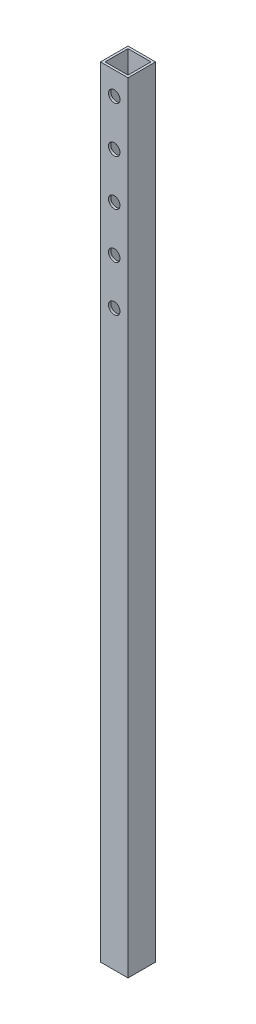
ISO-10303-21;
HEADER;
FILE_DESCRIPTION(('STEP AP214'),'2;1');
FILE_NAME('part.step','',(''),(''),'','','');
FILE_SCHEMA(('AUTOMOTIVE_DESIGN { 1 0 10303 214 1 1 1 1 }'));
ENDSEC;
DATA;
#1=APPLICATION_CONTEXT('core data for automotive mechanical design processes');
#2=APPLICATION_PROTOCOL_DEFINITION('international standard','automotive_design',2000,#1);
#3=PRODUCT_CONTEXT('',#1,'mechanical');
#4=PRODUCT('Part','Part','',(#3));
#5=PRODUCT_RELATED_PRODUCT_CATEGORY('part','',(#4));
#6=PRODUCT_DEFINITION_FORMATION('','',#4);
#7=PRODUCT_DEFINITION_CONTEXT('part definition',#1,'design');
#8=PRODUCT_DEFINITION('design','',#6,#7);
#9=PRODUCT_DEFINITION_SHAPE('','',#8);
#10=(LENGTH_UNIT() NAMED_UNIT(*) SI_UNIT(.MILLI.,.METRE.));
#11=(NAMED_UNIT(*) PLANE_ANGLE_UNIT() SI_UNIT($,.RADIAN.));
#12=(NAMED_UNIT(*) SI_UNIT($,.STERADIAN.) SOLID_ANGLE_UNIT());
#13=UNCERTAINTY_MEASURE_WITH_UNIT(LENGTH_MEASURE(1.E-05),#10,'distance_accuracy_value','');
#14=(GEOMETRIC_REPRESENTATION_CONTEXT(3) GLOBAL_UNCERTAINTY_ASSIGNED_CONTEXT((#13)) GLOBAL_UNIT_ASSIGNED_CONTEXT((#10,
#11,#12)) REPRESENTATION_CONTEXT('',''));
#15=CARTESIAN_POINT('',(0.,0.,0.));
#16=DIRECTION('',(0.,0.,1.));
#17=DIRECTION('',(1.,0.,0.));
#18=AXIS2_PLACEMENT_3D('',#15,#16,#17);
#19=CARTESIAN_POINT('',(-15.24,863.6,15.24));
#20=DIRECTION('',(0.,1.,0.));
#21=DIRECTION('',(0.,0.,1.));
#22=AXIS2_PLACEMENT_3D('',#19,#20,#21);
#23=PLANE('',#22);
#24=DIRECTION('',(0.,0.,1.));
#25=VECTOR('',#24,1.);
#26=CARTESIAN_POINT('',(-15.24,863.6,-12.7));
#27=LINE('',#26,#25);
#28=CARTESIAN_POINT('',(-15.24,863.6,-15.24));
#29=VERTEX_POINT('',#28);
#30=CARTESIAN_POINT('',(-15.24,863.6,15.24));
#31=VERTEX_POINT('',#30);
#32=EDGE_CURVE('E163',#29,#31,#27,.T.);
#33=ORIENTED_EDGE('',*,*,#32,.T.);
#34=DIRECTION('',(1.,0.,0.));
#35=VECTOR('',#34,1.);
#36=CARTESIAN_POINT('',(-12.7,863.6,15.24));
#37=LINE('',#36,#35);
#38=CARTESIAN_POINT('',(15.24,863.6,15.24));
#39=VERTEX_POINT('',#38);
#40=EDGE_CURVE('E166',#31,#39,#37,.T.);
#41=ORIENTED_EDGE('',*,*,#40,.T.);
#42=DIRECTION('',(0.,0.,-1.));
#43=VECTOR('',#42,1.);
#44=CARTESIAN_POINT('',(15.24,863.6,-12.7));
#45=LINE('',#44,#43);
#46=CARTESIAN_POINT('',(15.24,863.6,-15.24));
#47=VERTEX_POINT('',#46);
#48=EDGE_CURVE('E169',#39,#47,#45,.T.);
#49=ORIENTED_EDGE('',*,*,#48,.T.);
#50=DIRECTION('',(-1.,0.,0.));
#51=VECTOR('',#50,1.);
#52=CARTESIAN_POINT('',(-12.7,863.6,-15.24));
#53=LINE('',#52,#51);
#54=EDGE_CURVE('E171',#47,#29,#53,.T.);
#55=ORIENTED_EDGE('',*,*,#54,.T.);
#56=EDGE_LOOP('',(#33,#41,#49,#55));
#57=FACE_BOUND('',#56,.T.);
#58=DIRECTION('',(1.,0.,0.));
#59=VECTOR('',#58,1.);
#60=CARTESIAN_POINT('',(-12.7,863.6,12.7));
#61=LINE('',#60,#59);
#62=CARTESIAN_POINT('',(-12.7,863.6,12.7));
#63=VERTEX_POINT('',#62);
#64=CARTESIAN_POINT('',(12.7,863.6,12.7));
#65=VERTEX_POINT('',#64);
#66=EDGE_CURVE('E132',#63,#65,#61,.T.);
#67=ORIENTED_EDGE('',*,*,#66,.F.);
#68=DIRECTION('',(0.,0.,1.));
#69=VECTOR('',#68,1.);
#70=CARTESIAN_POINT('',(-12.7,863.6,-12.7));
#71=LINE('',#70,#69);
#72=CARTESIAN_POINT('',(-12.7,863.6,-12.7));
#73=VERTEX_POINT('',#72);
#74=EDGE_CURVE('E124',#73,#63,#71,.T.);
#75=ORIENTED_EDGE('',*,*,#74,.F.);
#76=DIRECTION('',(-1.,0.,0.));
#77=VECTOR('',#76,1.);
#78=CARTESIAN_POINT('',(-12.7,863.6,-12.7));
#79=LINE('',#78,#77);
#80=CARTESIAN_POINT('',(12.7,863.6,-12.7));
#81=VERTEX_POINT('',#80);
#82=EDGE_CURVE('E147',#81,#73,#79,.T.);
#83=ORIENTED_EDGE('',*,*,#82,.F.);
#84=DIRECTION('',(0.,0.,-1.));
#85=VECTOR('',#84,1.);
#86=CARTESIAN_POINT('',(12.7,863.6,-12.7));
#87=LINE('',#86,#85);
#88=EDGE_CURVE('E145',#65,#81,#87,.T.);
#89=ORIENTED_EDGE('',*,*,#88,.F.);
#90=EDGE_LOOP('',(#67,#75,#83,#89));
#91=FACE_BOUND('',#90,.T.);
#92=ADVANCED_FACE('F59',(#57,#91),#23,.T.);
#93=CARTESIAN_POINT('',(-15.24,0.,15.24));
#94=DIRECTION('',(0.,1.,0.));
#95=DIRECTION('',(0.,0.,1.));
#96=AXIS2_PLACEMENT_3D('',#93,#94,#95);
#97=PLANE('',#96);
#98=DIRECTION('',(0.,0.,1.));
#99=VECTOR('',#98,1.);
#100=CARTESIAN_POINT('',(-15.24,0.,-12.7));
#101=LINE('',#100,#99);
#102=CARTESIAN_POINT('',(-15.24,0.,-15.24));
#103=VERTEX_POINT('',#102);
#104=CARTESIAN_POINT('',(-15.24,0.,15.24));
#105=VERTEX_POINT('',#104);
#106=EDGE_CURVE('E141',#103,#105,#101,.T.);
#107=ORIENTED_EDGE('',*,*,#106,.F.);
#108=DIRECTION('',(-1.,0.,0.));
#109=VECTOR('',#108,1.);
#110=CARTESIAN_POINT('',(-12.7,0.,-15.24));
#111=LINE('',#110,#109);
#112=CARTESIAN_POINT('',(15.24,0.,-15.24));
#113=VERTEX_POINT('',#112);
#114=EDGE_CURVE('E167',#113,#103,#111,.T.);
#115=ORIENTED_EDGE('',*,*,#114,.F.);
#116=DIRECTION('',(0.,0.,-1.));
#117=VECTOR('',#116,1.);
#118=CARTESIAN_POINT('',(15.24,0.,-12.7));
#119=LINE('',#118,#117);
#120=CARTESIAN_POINT('',(15.24,0.,15.24));
#121=VERTEX_POINT('',#120);
#122=EDGE_CURVE('E178',#121,#113,#119,.T.);
#123=ORIENTED_EDGE('',*,*,#122,.F.);
#124=DIRECTION('',(1.,0.,0.));
#125=VECTOR('',#124,1.);
#126=CARTESIAN_POINT('',(-12.7,0.,15.24));
#127=LINE('',#126,#125);
#128=EDGE_CURVE('E176',#105,#121,#127,.T.);
#129=ORIENTED_EDGE('',*,*,#128,.F.);
#130=EDGE_LOOP('',(#107,#115,#123,#129));
#131=FACE_BOUND('',#130,.T.);
#132=DIRECTION('',(0.,0.,1.));
#133=VECTOR('',#132,1.);
#134=CARTESIAN_POINT('',(-12.7,0.,-12.7));
#135=LINE('',#134,#133);
#136=CARTESIAN_POINT('',(-12.7,0.,-12.7));
#137=VERTEX_POINT('',#136);
#138=CARTESIAN_POINT('',(-12.7,0.,12.7));
#139=VERTEX_POINT('',#138);
#140=EDGE_CURVE('E82',#137,#139,#135,.T.);
#141=ORIENTED_EDGE('',*,*,#140,.T.);
#142=DIRECTION('',(1.,0.,0.));
#143=VECTOR('',#142,1.);
#144=CARTESIAN_POINT('',(-12.7,0.,12.7));
#145=LINE('',#144,#143);
#146=CARTESIAN_POINT('',(12.7,0.,12.7));
#147=VERTEX_POINT('',#146);
#148=EDGE_CURVE('E140',#139,#147,#145,.T.);
#149=ORIENTED_EDGE('',*,*,#148,.T.);
#150=DIRECTION('',(0.,0.,-1.));
#151=VECTOR('',#150,1.);
#152=CARTESIAN_POINT('',(12.7,0.,-12.7));
#153=LINE('',#152,#151);
#154=CARTESIAN_POINT('',(12.7,0.,-12.7));
#155=VERTEX_POINT('',#154);
#156=EDGE_CURVE('E155',#147,#155,#153,.T.);
#157=ORIENTED_EDGE('',*,*,#156,.T.);
#158=DIRECTION('',(-1.,0.,0.));
#159=VECTOR('',#158,1.);
#160=CARTESIAN_POINT('',(-12.7,0.,-12.7));
#161=LINE('',#160,#159);
#162=EDGE_CURVE('E133',#155,#137,#161,.T.);
#163=ORIENTED_EDGE('',*,*,#162,.T.);
#164=EDGE_LOOP('',(#141,#149,#157,#163));
#165=FACE_BOUND('',#164,.T.);
#166=ADVANCED_FACE('F250',(#131,#165),#97,.F.);
#167=CARTESIAN_POINT('',(-15.24,863.6,-12.7));
#168=DIRECTION('',(1.,0.,0.));
#169=DIRECTION('',(0.,0.,-1.));
#170=AXIS2_PLACEMENT_3D('',#167,#168,#169);
#171=PLANE('',#170);
#172=ORIENTED_EDGE('',*,*,#106,.T.);
#173=DIRECTION('',(0.,-1.,0.));
#174=VECTOR('',#173,1.);
#175=CARTESIAN_POINT('',(-15.24,863.6,15.24));
#176=LINE('',#175,#174);
#177=EDGE_CURVE('E189',#31,#105,#176,.T.);
#178=ORIENTED_EDGE('',*,*,#177,.F.);
#179=ORIENTED_EDGE('',*,*,#32,.F.);
#180=DIRECTION('',(0.,-1.,0.));
#181=VECTOR('',#180,1.);
#182=CARTESIAN_POINT('',(-15.24,863.6,-15.24));
#183=LINE('',#182,#181);
#184=EDGE_CURVE('E173',#29,#103,#183,.T.);
#185=ORIENTED_EDGE('',*,*,#184,.T.);
#186=EDGE_LOOP('',(#172,#178,#179,#185));
#187=FACE_BOUND('',#186,.T.);
#188=ADVANCED_FACE('F256',(#187),#171,.F.);
#189=CARTESIAN_POINT('',(-12.7,863.6,15.24));
#190=DIRECTION('',(0.,0.,-1.));
#191=DIRECTION('',(-1.,0.,0.));
#192=AXIS2_PLACEMENT_3D('',#189,#190,#191);
#193=PLANE('',#192);
#194=CARTESIAN_POINT('',(0.,787.4,15.24));
#195=DIRECTION('',(0.,0.,1.));
#196=DIRECTION('',(1.,0.,0.));
#197=AXIS2_PLACEMENT_3D('',#194,#195,#196);
#198=CIRCLE('',#197,6.35);
#199=CARTESIAN_POINT('',(6.35,787.4,15.24));
#200=VERTEX_POINT('',#199);
#201=EDGE_CURVE('E453',#200,#200,#198,.T.);
#202=ORIENTED_EDGE('',*,*,#201,.F.);
#203=EDGE_LOOP('',(#202));
#204=FACE_BOUND('',#203,.T.);
#205=CARTESIAN_POINT('',(0.,838.2,15.24));
#206=DIRECTION('',(0.,0.,1.));
#207=DIRECTION('',(1.,0.,0.));
#208=AXIS2_PLACEMENT_3D('',#205,#206,#207);
#209=CIRCLE('',#208,6.35);
#210=CARTESIAN_POINT('',(6.35,838.2,15.24));
#211=VERTEX_POINT('',#210);
#212=EDGE_CURVE('E450',#211,#211,#209,.T.);
#213=ORIENTED_EDGE('',*,*,#212,.F.);
#214=EDGE_LOOP('',(#213));
#215=FACE_BOUND('',#214,.T.);
#216=ORIENTED_EDGE('',*,*,#128,.T.);
#217=DIRECTION('',(0.,-1.,0.));
#218=VECTOR('',#217,1.);
#219=CARTESIAN_POINT('',(15.24,863.6,15.24));
#220=LINE('',#219,#218);
#221=EDGE_CURVE('E186',#39,#121,#220,.T.);
#222=ORIENTED_EDGE('',*,*,#221,.F.);
#223=ORIENTED_EDGE('',*,*,#40,.F.);
#224=ORIENTED_EDGE('',*,*,#177,.T.);
#225=EDGE_LOOP('',(#216,#222,#223,#224));
#226=FACE_BOUND('',#225,.T.);
#227=CARTESIAN_POINT('',(0.,736.6,15.24));
#228=DIRECTION('',(0.,0.,1.));
#229=DIRECTION('',(1.,0.,0.));
#230=AXIS2_PLACEMENT_3D('',#227,#228,#229);
#231=CIRCLE('',#230,6.35);
#232=CARTESIAN_POINT('',(6.35,736.6,15.24));
#233=VERTEX_POINT('',#232);
#234=EDGE_CURVE('E199',#233,#233,#231,.T.);
#235=ORIENTED_EDGE('',*,*,#234,.F.);
#236=EDGE_LOOP('',(#235));
#237=FACE_BOUND('',#236,.T.);
#238=CARTESIAN_POINT('',(0.,685.8,15.24));
#239=DIRECTION('',(0.,0.,1.));
#240=DIRECTION('',(1.,0.,0.));
#241=AXIS2_PLACEMENT_3D('',#238,#239,#240);
#242=CIRCLE('',#241,6.35);
#243=CARTESIAN_POINT('',(6.35,685.8,15.24));
#244=VERTEX_POINT('',#243);
#245=EDGE_CURVE('E205',#244,#244,#242,.T.);
#246=ORIENTED_EDGE('',*,*,#245,.F.);
#247=EDGE_LOOP('',(#246));
#248=FACE_BOUND('',#247,.T.);
#249=CARTESIAN_POINT('',(0.,635.,15.24));
#250=DIRECTION('',(0.,0.,1.));
#251=DIRECTION('',(1.,0.,0.));
#252=AXIS2_PLACEMENT_3D('',#249,#250,#251);
#253=CIRCLE('',#252,6.35);
#254=CARTESIAN_POINT('',(6.35,635.,15.24));
#255=VERTEX_POINT('',#254);
#256=EDGE_CURVE('E211',#255,#255,#253,.T.);
#257=ORIENTED_EDGE('',*,*,#256,.F.);
#258=EDGE_LOOP('',(#257));
#259=FACE_BOUND('',#258,.T.);
#260=ADVANCED_FACE('F269',(#204,#215,#226,#237,#248,#259),#193,.F.);
#261=CARTESIAN_POINT('',(15.24,863.6,-12.7));
#262=DIRECTION('',(-1.,0.,0.));
#263=DIRECTION('',(0.,0.,1.));
#264=AXIS2_PLACEMENT_3D('',#261,#262,#263);
#265=PLANE('',#264);
#266=ORIENTED_EDGE('',*,*,#122,.T.);
#267=DIRECTION('',(0.,-1.,0.));
#268=VECTOR('',#267,1.);
#269=CARTESIAN_POINT('',(15.24,863.6,-15.24));
#270=LINE('',#269,#268);
#271=EDGE_CURVE('E183',#47,#113,#270,.T.);
#272=ORIENTED_EDGE('',*,*,#271,.F.);
#273=ORIENTED_EDGE('',*,*,#48,.F.);
#274=ORIENTED_EDGE('',*,*,#221,.T.);
#275=EDGE_LOOP('',(#266,#272,#273,#274));
#276=FACE_BOUND('',#275,.T.);
#277=ADVANCED_FACE('F265',(#276),#265,.F.);
#278=CARTESIAN_POINT('',(-12.7,863.6,-15.24));
#279=DIRECTION('',(0.,0.,1.));
#280=DIRECTION('',(1.,0.,0.));
#281=AXIS2_PLACEMENT_3D('',#278,#279,#280);
#282=PLANE('',#281);
#283=CARTESIAN_POINT('',(0.,787.4,-15.24));
#284=DIRECTION('',(0.,0.,1.));
#285=DIRECTION('',(1.,0.,0.));
#286=AXIS2_PLACEMENT_3D('',#283,#284,#285);
#287=CIRCLE('',#286,6.35);
#288=CARTESIAN_POINT('',(6.35,787.4,-15.24));
#289=VERTEX_POINT('',#288);
#290=EDGE_CURVE('E459',#289,#289,#287,.T.);
#291=ORIENTED_EDGE('',*,*,#290,.T.);
#292=EDGE_LOOP('',(#291));
#293=FACE_BOUND('',#292,.T.);
#294=CARTESIAN_POINT('',(0.,838.2,-15.24));
#295=DIRECTION('',(0.,0.,1.));
#296=DIRECTION('',(1.,0.,0.));
#297=AXIS2_PLACEMENT_3D('',#294,#295,#296);
#298=CIRCLE('',#297,6.35);
#299=CARTESIAN_POINT('',(6.35,838.2,-15.24));
#300=VERTEX_POINT('',#299);
#301=EDGE_CURVE('E196',#300,#300,#298,.T.);
#302=ORIENTED_EDGE('',*,*,#301,.T.);
#303=EDGE_LOOP('',(#302));
#304=FACE_BOUND('',#303,.T.);
#305=ORIENTED_EDGE('',*,*,#114,.T.);
#306=ORIENTED_EDGE('',*,*,#184,.F.);
#307=ORIENTED_EDGE('',*,*,#54,.F.);
#308=ORIENTED_EDGE('',*,*,#271,.T.);
#309=EDGE_LOOP('',(#305,#306,#307,#308));
#310=FACE_BOUND('',#309,.T.);
#311=CARTESIAN_POINT('',(0.,736.6,-15.24));
#312=DIRECTION('',(0.,0.,1.));
#313=DIRECTION('',(1.,0.,0.));
#314=AXIS2_PLACEMENT_3D('',#311,#312,#313);
#315=CIRCLE('',#314,6.35);
#316=CARTESIAN_POINT('',(6.35,736.6,-15.24));
#317=VERTEX_POINT('',#316);
#318=EDGE_CURVE('E217',#317,#317,#315,.T.);
#319=ORIENTED_EDGE('',*,*,#318,.T.);
#320=EDGE_LOOP('',(#319));
#321=FACE_BOUND('',#320,.T.);
#322=CARTESIAN_POINT('',(0.,685.8,-15.24));
#323=DIRECTION('',(0.,0.,1.));
#324=DIRECTION('',(1.,0.,0.));
#325=AXIS2_PLACEMENT_3D('',#322,#323,#324);
#326=CIRCLE('',#325,6.35);
#327=CARTESIAN_POINT('',(6.35,685.8,-15.24));
#328=VERTEX_POINT('',#327);
#329=EDGE_CURVE('E223',#328,#328,#326,.T.);
#330=ORIENTED_EDGE('',*,*,#329,.T.);
#331=EDGE_LOOP('',(#330));
#332=FACE_BOUND('',#331,.T.);
#333=CARTESIAN_POINT('',(0.,635.,-15.24));
#334=DIRECTION('',(0.,0.,1.));
#335=DIRECTION('',(1.,0.,0.));
#336=AXIS2_PLACEMENT_3D('',#333,#334,#335);
#337=CIRCLE('',#336,6.35);
#338=CARTESIAN_POINT('',(6.35,635.,-15.24));
#339=VERTEX_POINT('',#338);
#340=EDGE_CURVE('E12',#339,#339,#337,.T.);
#341=ORIENTED_EDGE('',*,*,#340,.T.);
#342=EDGE_LOOP('',(#341));
#343=FACE_BOUND('',#342,.T.);
#344=ADVANCED_FACE('F262',(#293,#304,#310,#321,#332,#343),#282,.F.);
#345=CARTESIAN_POINT('',(-12.7,863.6,-12.7));
#346=DIRECTION('',(1.,0.,0.));
#347=DIRECTION('',(0.,0.,-1.));
#348=AXIS2_PLACEMENT_3D('',#345,#346,#347);
#349=PLANE('',#348);
#350=ORIENTED_EDGE('',*,*,#140,.F.);
#351=DIRECTION('',(0.,-1.,0.));
#352=VECTOR('',#351,1.);
#353=CARTESIAN_POINT('',(-12.7,863.6,-12.7));
#354=LINE('',#353,#352);
#355=EDGE_CURVE('E128',#73,#137,#354,.T.);
#356=ORIENTED_EDGE('',*,*,#355,.F.);
#357=ORIENTED_EDGE('',*,*,#74,.T.);
#358=DIRECTION('',(0.,-1.,0.));
#359=VECTOR('',#358,1.);
#360=CARTESIAN_POINT('',(-12.7,863.6,12.7));
#361=LINE('',#360,#359);
#362=EDGE_CURVE('E127',#63,#139,#361,.T.);
#363=ORIENTED_EDGE('',*,*,#362,.T.);
#364=EDGE_LOOP('',(#350,#356,#357,#363));
#365=FACE_BOUND('',#364,.T.);
#366=ADVANCED_FACE('F126',(#365),#349,.T.);
#367=CARTESIAN_POINT('',(-12.7,863.6,12.7));
#368=DIRECTION('',(0.,0.,-1.));
#369=DIRECTION('',(-1.,0.,0.));
#370=AXIS2_PLACEMENT_3D('',#367,#368,#369);
#371=PLANE('',#370);
#372=CARTESIAN_POINT('',(0.,787.4,12.7));
#373=DIRECTION('',(0.,0.,-1.));
#374=DIRECTION('',(-1.,0.,0.));
#375=AXIS2_PLACEMENT_3D('',#372,#373,#374);
#376=CIRCLE('',#375,6.35);
#377=CARTESIAN_POINT('',(-6.35,787.4,12.7));
#378=VERTEX_POINT('',#377);
#379=EDGE_CURVE('E446',#378,#378,#376,.T.);
#380=ORIENTED_EDGE('',*,*,#379,.F.);
#381=EDGE_LOOP('',(#380));
#382=FACE_BOUND('',#381,.T.);
#383=CARTESIAN_POINT('',(0.,838.2,12.7));
#384=DIRECTION('',(0.,0.,-1.));
#385=DIRECTION('',(-1.,0.,0.));
#386=AXIS2_PLACEMENT_3D('',#383,#384,#385);
#387=CIRCLE('',#386,6.35);
#388=CARTESIAN_POINT('',(-6.35,838.2,12.7));
#389=VERTEX_POINT('',#388);
#390=EDGE_CURVE('E153',#389,#389,#387,.T.);
#391=ORIENTED_EDGE('',*,*,#390,.F.);
#392=EDGE_LOOP('',(#391));
#393=FACE_BOUND('',#392,.T.);
#394=ORIENTED_EDGE('',*,*,#148,.F.);
#395=ORIENTED_EDGE('',*,*,#362,.F.);
#396=ORIENTED_EDGE('',*,*,#66,.T.);
#397=DIRECTION('',(0.,-1.,0.));
#398=VECTOR('',#397,1.);
#399=CARTESIAN_POINT('',(12.7,863.6,12.7));
#400=LINE('',#399,#398);
#401=EDGE_CURVE('E142',#65,#147,#400,.T.);
#402=ORIENTED_EDGE('',*,*,#401,.T.);
#403=EDGE_LOOP('',(#394,#395,#396,#402));
#404=FACE_BOUND('',#403,.T.);
#405=CARTESIAN_POINT('',(0.,736.6,12.7));
#406=DIRECTION('',(0.,0.,-1.));
#407=DIRECTION('',(-1.,0.,0.));
#408=AXIS2_PLACEMENT_3D('',#405,#406,#407);
#409=CIRCLE('',#408,6.35);
#410=CARTESIAN_POINT('',(-6.35,736.6,12.7));
#411=VERTEX_POINT('',#410);
#412=EDGE_CURVE('E192',#411,#411,#409,.T.);
#413=ORIENTED_EDGE('',*,*,#412,.F.);
#414=EDGE_LOOP('',(#413));
#415=FACE_BOUND('',#414,.T.);
#416=CARTESIAN_POINT('',(0.,685.8,12.7));
#417=DIRECTION('',(0.,0.,-1.));
#418=DIRECTION('',(-1.,0.,0.));
#419=AXIS2_PLACEMENT_3D('',#416,#417,#418);
#420=CIRCLE('',#419,6.35);
#421=CARTESIAN_POINT('',(-6.35,685.8,12.7));
#422=VERTEX_POINT('',#421);
#423=EDGE_CURVE('E202',#422,#422,#420,.T.);
#424=ORIENTED_EDGE('',*,*,#423,.F.);
#425=EDGE_LOOP('',(#424));
#426=FACE_BOUND('',#425,.T.);
#427=CARTESIAN_POINT('',(0.,635.,12.7));
#428=DIRECTION('',(0.,0.,-1.));
#429=DIRECTION('',(-1.,0.,0.));
#430=AXIS2_PLACEMENT_3D('',#427,#428,#429);
#431=CIRCLE('',#430,6.35);
#432=CARTESIAN_POINT('',(-6.35,635.,12.7));
#433=VERTEX_POINT('',#432);
#434=EDGE_CURVE('E208',#433,#433,#431,.T.);
#435=ORIENTED_EDGE('',*,*,#434,.F.);
#436=EDGE_LOOP('',(#435));
#437=FACE_BOUND('',#436,.T.);
#438=ADVANCED_FACE('F136',(#382,#393,#404,#415,#426,#437),#371,.T.);
#439=CARTESIAN_POINT('',(12.7,863.6,-12.7));
#440=DIRECTION('',(-1.,0.,0.));
#441=DIRECTION('',(0.,0.,1.));
#442=AXIS2_PLACEMENT_3D('',#439,#440,#441);
#443=PLANE('',#442);
#444=ORIENTED_EDGE('',*,*,#156,.F.);
#445=ORIENTED_EDGE('',*,*,#401,.F.);
#446=ORIENTED_EDGE('',*,*,#88,.T.);
#447=DIRECTION('',(0.,-1.,0.));
#448=VECTOR('',#447,1.);
#449=CARTESIAN_POINT('',(12.7,863.6,-12.7));
#450=LINE('',#449,#448);
#451=EDGE_CURVE('E74',#81,#155,#450,.T.);
#452=ORIENTED_EDGE('',*,*,#451,.T.);
#453=EDGE_LOOP('',(#444,#445,#446,#452));
#454=FACE_BOUND('',#453,.T.);
#455=ADVANCED_FACE('F233',(#454),#443,.T.);
#456=CARTESIAN_POINT('',(-12.7,863.6,-12.7));
#457=DIRECTION('',(0.,0.,1.));
#458=DIRECTION('',(1.,0.,0.));
#459=AXIS2_PLACEMENT_3D('',#456,#457,#458);
#460=PLANE('',#459);
#461=CARTESIAN_POINT('',(0.,787.4,-12.7));
#462=DIRECTION('',(0.,0.,1.));
#463=DIRECTION('',(1.,0.,0.));
#464=AXIS2_PLACEMENT_3D('',#461,#462,#463);
#465=CIRCLE('',#464,6.35);
#466=CARTESIAN_POINT('',(6.35,787.4,-12.7));
#467=VERTEX_POINT('',#466);
#468=EDGE_CURVE('E462',#467,#467,#465,.T.);
#469=ORIENTED_EDGE('',*,*,#468,.F.);
#470=EDGE_LOOP('',(#469));
#471=FACE_BOUND('',#470,.T.);
#472=CARTESIAN_POINT('',(0.,838.2,-12.7));
#473=DIRECTION('',(0.,0.,1.));
#474=DIRECTION('',(1.,0.,0.));
#475=AXIS2_PLACEMENT_3D('',#472,#473,#474);
#476=CIRCLE('',#475,6.35);
#477=CARTESIAN_POINT('',(6.35,838.2,-12.7));
#478=VERTEX_POINT('',#477);
#479=EDGE_CURVE('E193',#478,#478,#476,.T.);
#480=ORIENTED_EDGE('',*,*,#479,.F.);
#481=EDGE_LOOP('',(#480));
#482=FACE_BOUND('',#481,.T.);
#483=ORIENTED_EDGE('',*,*,#162,.F.);
#484=ORIENTED_EDGE('',*,*,#451,.F.);
#485=ORIENTED_EDGE('',*,*,#82,.T.);
#486=ORIENTED_EDGE('',*,*,#355,.T.);
#487=EDGE_LOOP('',(#483,#484,#485,#486));
#488=FACE_BOUND('',#487,.T.);
#489=CARTESIAN_POINT('',(0.,736.6,-12.7));
#490=DIRECTION('',(0.,0.,1.));
#491=DIRECTION('',(1.,0.,0.));
#492=AXIS2_PLACEMENT_3D('',#489,#490,#491);
#493=CIRCLE('',#492,6.35);
#494=CARTESIAN_POINT('',(6.35,736.6,-12.7));
#495=VERTEX_POINT('',#494);
#496=EDGE_CURVE('E214',#495,#495,#493,.T.);
#497=ORIENTED_EDGE('',*,*,#496,.F.);
#498=EDGE_LOOP('',(#497));
#499=FACE_BOUND('',#498,.T.);
#500=CARTESIAN_POINT('',(0.,685.8,-12.7));
#501=DIRECTION('',(0.,0.,1.));
#502=DIRECTION('',(1.,0.,0.));
#503=AXIS2_PLACEMENT_3D('',#500,#501,#502);
#504=CIRCLE('',#503,6.35);
#505=CARTESIAN_POINT('',(6.35,685.8,-12.7));
#506=VERTEX_POINT('',#505);
#507=EDGE_CURVE('E220',#506,#506,#504,.T.);
#508=ORIENTED_EDGE('',*,*,#507,.F.);
#509=EDGE_LOOP('',(#508));
#510=FACE_BOUND('',#509,.T.);
#511=CARTESIAN_POINT('',(0.,635.,-12.7));
#512=DIRECTION('',(0.,0.,1.));
#513=DIRECTION('',(1.,0.,0.));
#514=AXIS2_PLACEMENT_3D('',#511,#512,#513);
#515=CIRCLE('',#514,6.35);
#516=CARTESIAN_POINT('',(6.35,635.,-12.7));
#517=VERTEX_POINT('',#516);
#518=EDGE_CURVE('E67',#517,#517,#515,.T.);
#519=ORIENTED_EDGE('',*,*,#518,.F.);
#520=EDGE_LOOP('',(#519));
#521=FACE_BOUND('',#520,.T.);
#522=ADVANCED_FACE('F230',(#471,#482,#488,#499,#510,#521),#460,.T.);
#523=CARTESIAN_POINT('',(0.,838.2,-15.24));
#524=DIRECTION('',(0.,0.,1.));
#525=DIRECTION('',(1.,0.,0.));
#526=AXIS2_PLACEMENT_3D('',#523,#524,#525);
#527=CYLINDRICAL_SURFACE('',#526,6.35);
#528=ORIENTED_EDGE('',*,*,#479,.T.);
#529=EDGE_LOOP('',(#528));
#530=FACE_BOUND('',#529,.T.);
#531=ORIENTED_EDGE('',*,*,#301,.F.);
#532=EDGE_LOOP('',(#531));
#533=FACE_BOUND('',#532,.T.);
#534=ADVANCED_FACE('F232',(#530,#533),#527,.F.);
#535=ORIENTED_EDGE('',*,*,#390,.T.);
#536=EDGE_LOOP('',(#535));
#537=FACE_BOUND('',#536,.T.);
#538=ORIENTED_EDGE('',*,*,#212,.T.);
#539=EDGE_LOOP('',(#538));
#540=FACE_BOUND('',#539,.T.);
#541=ADVANCED_FACE('F241',(#537,#540),#527,.F.);
#542=CARTESIAN_POINT('',(0.,787.4,-15.24));
#543=DIRECTION('',(0.,0.,1.));
#544=DIRECTION('',(1.,0.,0.));
#545=AXIS2_PLACEMENT_3D('',#542,#543,#544);
#546=CYLINDRICAL_SURFACE('',#545,6.35);
#547=ORIENTED_EDGE('',*,*,#379,.T.);
#548=EDGE_LOOP('',(#547));
#549=FACE_BOUND('',#548,.T.);
#550=ORIENTED_EDGE('',*,*,#201,.T.);
#551=EDGE_LOOP('',(#550));
#552=FACE_BOUND('',#551,.T.);
#553=ADVANCED_FACE('F281',(#549,#552),#546,.F.);
#554=CARTESIAN_POINT('',(0.,736.6,-15.24));
#555=DIRECTION('',(0.,0.,1.));
#556=DIRECTION('',(1.,0.,0.));
#557=AXIS2_PLACEMENT_3D('',#554,#555,#556);
#558=CYLINDRICAL_SURFACE('',#557,6.35);
#559=ORIENTED_EDGE('',*,*,#412,.T.);
#560=EDGE_LOOP('',(#559));
#561=FACE_BOUND('',#560,.T.);
#562=ORIENTED_EDGE('',*,*,#234,.T.);
#563=EDGE_LOOP('',(#562));
#564=FACE_BOUND('',#563,.T.);
#565=ADVANCED_FACE('F277',(#561,#564),#558,.F.);
#566=CARTESIAN_POINT('',(0.,685.8,-15.24));
#567=DIRECTION('',(0.,0.,1.));
#568=DIRECTION('',(1.,0.,0.));
#569=AXIS2_PLACEMENT_3D('',#566,#567,#568);
#570=CYLINDRICAL_SURFACE('',#569,6.35);
#571=ORIENTED_EDGE('',*,*,#423,.T.);
#572=EDGE_LOOP('',(#571));
#573=FACE_BOUND('',#572,.T.);
#574=ORIENTED_EDGE('',*,*,#245,.T.);
#575=EDGE_LOOP('',(#574));
#576=FACE_BOUND('',#575,.T.);
#577=ADVANCED_FACE('F280',(#573,#576),#570,.F.);
#578=CARTESIAN_POINT('',(0.,635.,-15.24));
#579=DIRECTION('',(0.,0.,1.));
#580=DIRECTION('',(1.,0.,0.));
#581=AXIS2_PLACEMENT_3D('',#578,#579,#580);
#582=CYLINDRICAL_SURFACE('',#581,6.35);
#583=ORIENTED_EDGE('',*,*,#434,.T.);
#584=EDGE_LOOP('',(#583));
#585=FACE_BOUND('',#584,.T.);
#586=ORIENTED_EDGE('',*,*,#256,.T.);
#587=EDGE_LOOP('',(#586));
#588=FACE_BOUND('',#587,.T.);
#589=ADVANCED_FACE('F285',(#585,#588),#582,.F.);
#590=CARTESIAN_POINT('',(0.,787.4,-15.24));
#591=DIRECTION('',(0.,0.,1.));
#592=DIRECTION('',(1.,0.,0.));
#593=AXIS2_PLACEMENT_3D('',#590,#591,#592);
#594=CYLINDRICAL_SURFACE('',#593,6.35);
#595=ORIENTED_EDGE('',*,*,#468,.T.);
#596=EDGE_LOOP('',(#595));
#597=FACE_BOUND('',#596,.T.);
#598=ORIENTED_EDGE('',*,*,#290,.F.);
#599=EDGE_LOOP('',(#598));
#600=FACE_BOUND('',#599,.T.);
#601=ADVANCED_FACE('F289',(#597,#600),#594,.F.);
#602=CARTESIAN_POINT('',(0.,736.6,-15.24));
#603=DIRECTION('',(0.,0.,1.));
#604=DIRECTION('',(1.,0.,0.));
#605=AXIS2_PLACEMENT_3D('',#602,#603,#604);
#606=CYLINDRICAL_SURFACE('',#605,6.35);
#607=ORIENTED_EDGE('',*,*,#496,.T.);
#608=EDGE_LOOP('',(#607));
#609=FACE_BOUND('',#608,.T.);
#610=ORIENTED_EDGE('',*,*,#318,.F.);
#611=EDGE_LOOP('',(#610));
#612=FACE_BOUND('',#611,.T.);
#613=ADVANCED_FACE('F291',(#609,#612),#606,.F.);
#614=CARTESIAN_POINT('',(0.,685.8,-15.24));
#615=DIRECTION('',(0.,0.,1.));
#616=DIRECTION('',(1.,0.,0.));
#617=AXIS2_PLACEMENT_3D('',#614,#615,#616);
#618=CYLINDRICAL_SURFACE('',#617,6.35);
#619=ORIENTED_EDGE('',*,*,#507,.T.);
#620=EDGE_LOOP('',(#619));
#621=FACE_BOUND('',#620,.T.);
#622=ORIENTED_EDGE('',*,*,#329,.F.);
#623=EDGE_LOOP('',(#622));
#624=FACE_BOUND('',#623,.T.);
#625=ADVANCED_FACE('F293',(#621,#624),#618,.F.);
#626=CARTESIAN_POINT('',(0.,635.,-15.24));
#627=DIRECTION('',(0.,0.,1.));
#628=DIRECTION('',(1.,0.,0.));
#629=AXIS2_PLACEMENT_3D('',#626,#627,#628);
#630=CYLINDRICAL_SURFACE('',#629,6.35);
#631=ORIENTED_EDGE('',*,*,#518,.T.);
#632=EDGE_LOOP('',(#631));
#633=FACE_BOUND('',#632,.T.);
#634=ORIENTED_EDGE('',*,*,#340,.F.);
#635=EDGE_LOOP('',(#634));
#636=FACE_BOUND('',#635,.T.);
#637=ADVANCED_FACE('F61',(#633,#636),#630,.F.);
#638=CLOSED_SHELL('',(#92,#166,#188,#260,#277,#344,#366,#438,#455,#522,#534,#541,#553,#565,#577,
#589,#601,#613,#625,#637));
#639=MANIFOLD_SOLID_BREP('B2',#638);
#640=ADVANCED_BREP_SHAPE_REPRESENTATION('',(#18,#639),#14);
#641=SHAPE_DEFINITION_REPRESENTATION(#9,#640);
ENDSEC;
END-ISO-10303-21;
